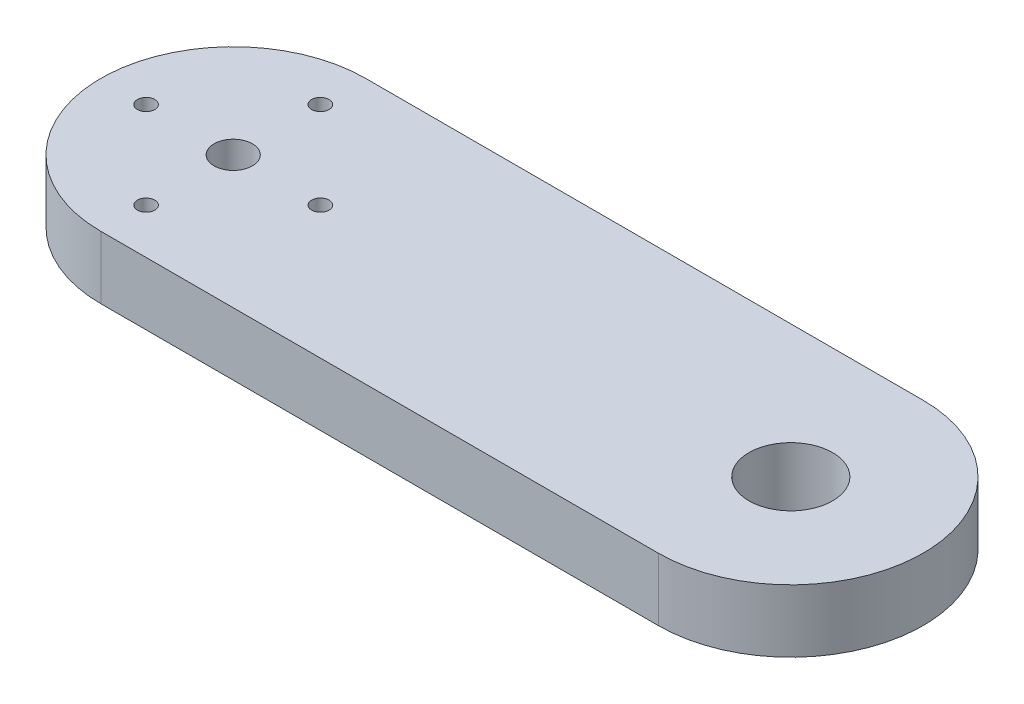
ISO-10303-21;
HEADER;
FILE_DESCRIPTION(('STEP AP214'),'2;1');
FILE_NAME('part.step','',(''),(''),'','','');
FILE_SCHEMA(('AUTOMOTIVE_DESIGN { 1 0 10303 214 1 1 1 1 }'));
ENDSEC;
DATA;
#1=APPLICATION_CONTEXT('core data for automotive mechanical design processes');
#2=APPLICATION_PROTOCOL_DEFINITION('international standard','automotive_design',2000,#1);
#3=PRODUCT_CONTEXT('',#1,'mechanical');
#4=PRODUCT('Part','Part','',(#3));
#5=PRODUCT_RELATED_PRODUCT_CATEGORY('part','',(#4));
#6=PRODUCT_DEFINITION_FORMATION('','',#4);
#7=PRODUCT_DEFINITION_CONTEXT('part definition',#1,'design');
#8=PRODUCT_DEFINITION('design','',#6,#7);
#9=PRODUCT_DEFINITION_SHAPE('','',#8);
#10=(LENGTH_UNIT() NAMED_UNIT(*) SI_UNIT(.MILLI.,.METRE.));
#11=(NAMED_UNIT(*) PLANE_ANGLE_UNIT() SI_UNIT($,.RADIAN.));
#12=(NAMED_UNIT(*) SI_UNIT($,.STERADIAN.) SOLID_ANGLE_UNIT());
#13=UNCERTAINTY_MEASURE_WITH_UNIT(LENGTH_MEASURE(1.E-05),#10,'distance_accuracy_value','');
#14=(GEOMETRIC_REPRESENTATION_CONTEXT(3) GLOBAL_UNCERTAINTY_ASSIGNED_CONTEXT((#13)) GLOBAL_UNIT_ASSIGNED_CONTEXT((#10,
#11,#12)) REPRESENTATION_CONTEXT('',''));
#15=CARTESIAN_POINT('',(0.,0.,0.));
#16=DIRECTION('',(0.,0.,1.));
#17=DIRECTION('',(1.,0.,0.));
#18=AXIS2_PLACEMENT_3D('',#15,#16,#17);
#19=CARTESIAN_POINT('',(0.,9.,0.));
#20=DIRECTION('',(0.,1.,0.));
#21=DIRECTION('',(0.,0.,1.));
#22=AXIS2_PLACEMENT_3D('',#19,#20,#21);
#23=PLANE('',#22);
#24=CARTESIAN_POINT('',(0.,9.,-12.5));
#25=DIRECTION('',(0.,1.,0.));
#26=DIRECTION('',(0.,0.,1.));
#27=AXIS2_PLACEMENT_3D('',#24,#25,#26);
#28=CIRCLE('',#27,1.24999999999999);
#29=CARTESIAN_POINT('',(0.,9.,-11.25));
#30=VERTEX_POINT('',#29);
#31=EDGE_CURVE('E145',#30,#30,#28,.T.);
#32=ORIENTED_EDGE('',*,*,#31,.F.);
#33=EDGE_LOOP('',(#32));
#34=FACE_BOUND('',#33,.T.);
#35=CARTESIAN_POINT('',(12.5000000000004,9.,-3.53740559381116E-13));
#36=DIRECTION('',(0.,1.,0.));
#37=DIRECTION('',(0.,0.,1.));
#38=AXIS2_PLACEMENT_3D('',#35,#36,#37);
#39=CIRCLE('',#38,1.24999999999999);
#40=CARTESIAN_POINT('',(12.5000000000004,9.,1.24999999999963));
#41=VERTEX_POINT('',#40);
#42=EDGE_CURVE('E139',#41,#41,#39,.T.);
#43=ORIENTED_EDGE('',*,*,#42,.F.);
#44=EDGE_LOOP('',(#43));
#45=FACE_BOUND('',#44,.T.);
#46=CARTESIAN_POINT('',(7.07481118762232E-13,9.,12.5));
#47=DIRECTION('',(0.,1.,0.));
#48=DIRECTION('',(0.,0.,1.));
#49=AXIS2_PLACEMENT_3D('',#46,#47,#48);
#50=CIRCLE('',#49,1.24999999999999);
#51=CARTESIAN_POINT('',(7.07481118762232E-13,9.,13.75));
#52=VERTEX_POINT('',#51);
#53=EDGE_CURVE('E133',#52,#52,#50,.T.);
#54=ORIENTED_EDGE('',*,*,#53,.F.);
#55=EDGE_LOOP('',(#54));
#56=FACE_BOUND('',#55,.T.);
#57=CARTESIAN_POINT('',(-12.4999999999996,9.,3.5527136788005E-13));
#58=DIRECTION('',(0.,1.,0.));
#59=DIRECTION('',(0.,0.,1.));
#60=AXIS2_PLACEMENT_3D('',#57,#58,#59);
#61=CIRCLE('',#60,1.24999999999999);
#62=CARTESIAN_POINT('',(-12.4999999999996,9.,1.25000000000034));
#63=VERTEX_POINT('',#62);
#64=EDGE_CURVE('E127',#63,#63,#61,.T.);
#65=ORIENTED_EDGE('',*,*,#64,.F.);
#66=EDGE_LOOP('',(#65));
#67=FACE_BOUND('',#66,.T.);
#68=CARTESIAN_POINT('',(0.,9.,0.));
#69=DIRECTION('',(0.,1.,0.));
#70=DIRECTION('',(0.,0.,1.));
#71=AXIS2_PLACEMENT_3D('',#68,#69,#70);
#72=CIRCLE('',#71,2.75);
#73=CARTESIAN_POINT('',(0.,9.,2.75));
#74=VERTEX_POINT('',#73);
#75=EDGE_CURVE('E101',#74,#74,#72,.T.);
#76=ORIENTED_EDGE('',*,*,#75,.F.);
#77=EDGE_LOOP('',(#76));
#78=FACE_BOUND('',#77,.T.);
#79=CARTESIAN_POINT('',(0.,9.,0.));
#80=DIRECTION('',(0.,1.,0.));
#81=DIRECTION('',(0.,0.,1.));
#82=AXIS2_PLACEMENT_3D('',#79,#80,#81);
#83=CIRCLE('',#82,19.);
#84=CARTESIAN_POINT('',(0.,9.,-19.));
#85=VERTEX_POINT('',#84);
#86=CARTESIAN_POINT('',(0.,9.,19.));
#87=VERTEX_POINT('',#86);
#88=EDGE_CURVE('E86',#85,#87,#83,.T.);
#89=ORIENTED_EDGE('',*,*,#88,.T.);
#90=DIRECTION('',(1.,0.,0.));
#91=VECTOR('',#90,1.);
#92=CARTESIAN_POINT('',(0.,9.,19.));
#93=LINE('',#92,#91);
#94=CARTESIAN_POINT('',(80.,9.,19.));
#95=VERTEX_POINT('',#94);
#96=EDGE_CURVE('E81',#87,#95,#93,.T.);
#97=ORIENTED_EDGE('',*,*,#96,.T.);
#98=CARTESIAN_POINT('',(80.,9.,0.));
#99=DIRECTION('',(0.,1.,0.));
#100=DIRECTION('',(0.,0.,1.));
#101=AXIS2_PLACEMENT_3D('',#98,#99,#100);
#102=CIRCLE('',#101,19.);
#103=CARTESIAN_POINT('',(80.,9.,-19.));
#104=VERTEX_POINT('',#103);
#105=EDGE_CURVE('E84',#95,#104,#102,.T.);
#106=ORIENTED_EDGE('',*,*,#105,.T.);
#107=DIRECTION('',(-1.,0.,0.));
#108=VECTOR('',#107,1.);
#109=CARTESIAN_POINT('',(0.,9.,-19.));
#110=LINE('',#109,#108);
#111=EDGE_CURVE('E51',#104,#85,#110,.T.);
#112=ORIENTED_EDGE('',*,*,#111,.T.);
#113=EDGE_LOOP('',(#89,#97,#106,#112));
#114=FACE_BOUND('',#113,.T.);
#115=CARTESIAN_POINT('',(80.,9.,0.));
#116=DIRECTION('',(0.,1.,0.));
#117=DIRECTION('',(0.,0.,1.));
#118=AXIS2_PLACEMENT_3D('',#115,#116,#117);
#119=CIRCLE('',#118,6.);
#120=CARTESIAN_POINT('',(80.,9.,6.));
#121=VERTEX_POINT('',#120);
#122=EDGE_CURVE('E116',#121,#121,#119,.T.);
#123=ORIENTED_EDGE('',*,*,#122,.F.);
#124=EDGE_LOOP('',(#123));
#125=FACE_BOUND('',#124,.T.);
#126=ADVANCED_FACE('F34',(#34,#45,#56,#67,#78,#114,#125),#23,.T.);
#127=CARTESIAN_POINT('',(0.,0.,0.));
#128=DIRECTION('',(0.,1.,0.));
#129=DIRECTION('',(0.,0.,1.));
#130=AXIS2_PLACEMENT_3D('',#127,#128,#129);
#131=PLANE('',#130);
#132=CARTESIAN_POINT('',(0.,0.,-12.5));
#133=DIRECTION('',(0.,1.,0.));
#134=DIRECTION('',(0.,0.,1.));
#135=AXIS2_PLACEMENT_3D('',#132,#133,#134);
#136=CIRCLE('',#135,1.25);
#137=CARTESIAN_POINT('',(0.,0.,-11.25));
#138=VERTEX_POINT('',#137);
#139=EDGE_CURVE('E142',#138,#138,#136,.T.);
#140=ORIENTED_EDGE('',*,*,#139,.T.);
#141=EDGE_LOOP('',(#140));
#142=FACE_BOUND('',#141,.T.);
#143=CARTESIAN_POINT('',(12.5000000000004,0.,-3.53740559381116E-13));
#144=DIRECTION('',(0.,1.,0.));
#145=DIRECTION('',(0.,0.,1.));
#146=AXIS2_PLACEMENT_3D('',#143,#144,#145);
#147=CIRCLE('',#146,1.25);
#148=CARTESIAN_POINT('',(12.5000000000004,0.,1.24999999999964));
#149=VERTEX_POINT('',#148);
#150=EDGE_CURVE('E136',#149,#149,#147,.T.);
#151=ORIENTED_EDGE('',*,*,#150,.T.);
#152=EDGE_LOOP('',(#151));
#153=FACE_BOUND('',#152,.T.);
#154=CARTESIAN_POINT('',(7.07481118762232E-13,0.,12.5));
#155=DIRECTION('',(0.,1.,0.));
#156=DIRECTION('',(0.,0.,1.));
#157=AXIS2_PLACEMENT_3D('',#154,#155,#156);
#158=CIRCLE('',#157,1.25);
#159=CARTESIAN_POINT('',(7.07481118762232E-13,0.,13.75));
#160=VERTEX_POINT('',#159);
#161=EDGE_CURVE('E130',#160,#160,#158,.T.);
#162=ORIENTED_EDGE('',*,*,#161,.T.);
#163=EDGE_LOOP('',(#162));
#164=FACE_BOUND('',#163,.T.);
#165=CARTESIAN_POINT('',(-12.4999999999996,0.,3.5527136788005E-13));
#166=DIRECTION('',(0.,1.,0.));
#167=DIRECTION('',(0.,0.,1.));
#168=AXIS2_PLACEMENT_3D('',#165,#166,#167);
#169=CIRCLE('',#168,1.25);
#170=CARTESIAN_POINT('',(-12.4999999999996,0.,1.25000000000035));
#171=VERTEX_POINT('',#170);
#172=EDGE_CURVE('E122',#171,#171,#169,.T.);
#173=ORIENTED_EDGE('',*,*,#172,.T.);
#174=EDGE_LOOP('',(#173));
#175=FACE_BOUND('',#174,.T.);
#176=CARTESIAN_POINT('',(0.,0.,0.));
#177=DIRECTION('',(0.,1.,0.));
#178=DIRECTION('',(0.,0.,1.));
#179=AXIS2_PLACEMENT_3D('',#176,#177,#178);
#180=CIRCLE('',#179,2.75);
#181=CARTESIAN_POINT('',(0.,0.,2.75));
#182=VERTEX_POINT('',#181);
#183=EDGE_CURVE('E113',#182,#182,#180,.T.);
#184=ORIENTED_EDGE('',*,*,#183,.T.);
#185=EDGE_LOOP('',(#184));
#186=FACE_BOUND('',#185,.T.);
#187=CARTESIAN_POINT('',(0.,0.,0.));
#188=DIRECTION('',(0.,1.,0.));
#189=DIRECTION('',(0.,0.,1.));
#190=AXIS2_PLACEMENT_3D('',#187,#188,#189);
#191=CIRCLE('',#190,19.);
#192=CARTESIAN_POINT('',(0.,0.,-19.));
#193=VERTEX_POINT('',#192);
#194=CARTESIAN_POINT('',(0.,0.,19.));
#195=VERTEX_POINT('',#194);
#196=EDGE_CURVE('E98',#193,#195,#191,.T.);
#197=ORIENTED_EDGE('',*,*,#196,.F.);
#198=DIRECTION('',(-1.,0.,0.));
#199=VECTOR('',#198,1.);
#200=CARTESIAN_POINT('',(0.,0.,-19.));
#201=LINE('',#200,#199);
#202=CARTESIAN_POINT('',(80.,0.,-19.));
#203=VERTEX_POINT('',#202);
#204=EDGE_CURVE('E74',#203,#193,#201,.T.);
#205=ORIENTED_EDGE('',*,*,#204,.F.);
#206=CARTESIAN_POINT('',(80.,0.,0.));
#207=DIRECTION('',(0.,1.,0.));
#208=DIRECTION('',(0.,0.,1.));
#209=AXIS2_PLACEMENT_3D('',#206,#207,#208);
#210=CIRCLE('',#209,19.);
#211=CARTESIAN_POINT('',(80.,0.,19.));
#212=VERTEX_POINT('',#211);
#213=EDGE_CURVE('E68',#212,#203,#210,.T.);
#214=ORIENTED_EDGE('',*,*,#213,.F.);
#215=DIRECTION('',(1.,0.,0.));
#216=VECTOR('',#215,1.);
#217=CARTESIAN_POINT('',(0.,0.,19.));
#218=LINE('',#217,#216);
#219=EDGE_CURVE('E90',#195,#212,#218,.T.);
#220=ORIENTED_EDGE('',*,*,#219,.F.);
#221=EDGE_LOOP('',(#197,#205,#214,#220));
#222=FACE_BOUND('',#221,.T.);
#223=CARTESIAN_POINT('',(80.,0.,0.));
#224=DIRECTION('',(0.,1.,0.));
#225=DIRECTION('',(0.,0.,1.));
#226=AXIS2_PLACEMENT_3D('',#223,#224,#225);
#227=CIRCLE('',#226,6.);
#228=CARTESIAN_POINT('',(80.,0.,6.));
#229=VERTEX_POINT('',#228);
#230=EDGE_CURVE('E119',#229,#229,#227,.T.);
#231=ORIENTED_EDGE('',*,*,#230,.T.);
#232=EDGE_LOOP('',(#231));
#233=FACE_BOUND('',#232,.T.);
#234=ADVANCED_FACE('F109',(#142,#153,#164,#175,#186,#222,#233),#131,.F.);
#235=CARTESIAN_POINT('',(0.,9.,0.));
#236=DIRECTION('',(0.,-1.,0.));
#237=DIRECTION('',(0.,0.,-1.));
#238=AXIS2_PLACEMENT_3D('',#235,#236,#237);
#239=CYLINDRICAL_SURFACE('',#238,19.);
#240=ORIENTED_EDGE('',*,*,#196,.T.);
#241=DIRECTION('',(0.,-1.,0.));
#242=VECTOR('',#241,1.);
#243=CARTESIAN_POINT('',(0.,9.,19.));
#244=LINE('',#243,#242);
#245=EDGE_CURVE('E11',#87,#195,#244,.T.);
#246=ORIENTED_EDGE('',*,*,#245,.F.);
#247=ORIENTED_EDGE('',*,*,#88,.F.);
#248=DIRECTION('',(0.,-1.,0.));
#249=VECTOR('',#248,1.);
#250=CARTESIAN_POINT('',(0.,9.,-19.));
#251=LINE('',#250,#249);
#252=EDGE_CURVE('E94',#85,#193,#251,.T.);
#253=ORIENTED_EDGE('',*,*,#252,.T.);
#254=EDGE_LOOP('',(#240,#246,#247,#253));
#255=FACE_BOUND('',#254,.T.);
#256=ADVANCED_FACE('F36',(#255),#239,.T.);
#257=CARTESIAN_POINT('',(0.,9.,19.));
#258=DIRECTION('',(0.,0.,-1.));
#259=DIRECTION('',(-1.,0.,0.));
#260=AXIS2_PLACEMENT_3D('',#257,#258,#259);
#261=PLANE('',#260);
#262=ORIENTED_EDGE('',*,*,#219,.T.);
#263=DIRECTION('',(0.,-1.,0.));
#264=VECTOR('',#263,1.);
#265=CARTESIAN_POINT('',(80.,9.,19.));
#266=LINE('',#265,#264);
#267=EDGE_CURVE('E43',#95,#212,#266,.T.);
#268=ORIENTED_EDGE('',*,*,#267,.F.);
#269=ORIENTED_EDGE('',*,*,#96,.F.);
#270=ORIENTED_EDGE('',*,*,#245,.T.);
#271=EDGE_LOOP('',(#262,#268,#269,#270));
#272=FACE_BOUND('',#271,.T.);
#273=ADVANCED_FACE('F89',(#272),#261,.F.);
#274=CARTESIAN_POINT('',(80.,9.,0.));
#275=DIRECTION('',(0.,-1.,0.));
#276=DIRECTION('',(0.,0.,-1.));
#277=AXIS2_PLACEMENT_3D('',#274,#275,#276);
#278=CYLINDRICAL_SURFACE('',#277,19.);
#279=ORIENTED_EDGE('',*,*,#213,.T.);
#280=DIRECTION('',(0.,-1.,0.));
#281=VECTOR('',#280,1.);
#282=CARTESIAN_POINT('',(80.,9.,-19.));
#283=LINE('',#282,#281);
#284=EDGE_CURVE('E91',#104,#203,#283,.T.);
#285=ORIENTED_EDGE('',*,*,#284,.F.);
#286=ORIENTED_EDGE('',*,*,#105,.F.);
#287=ORIENTED_EDGE('',*,*,#267,.T.);
#288=EDGE_LOOP('',(#279,#285,#286,#287));
#289=FACE_BOUND('',#288,.T.);
#290=ADVANCED_FACE('F92',(#289),#278,.T.);
#291=CARTESIAN_POINT('',(0.,9.,-19.));
#292=DIRECTION('',(0.,0.,1.));
#293=DIRECTION('',(1.,0.,0.));
#294=AXIS2_PLACEMENT_3D('',#291,#292,#293);
#295=PLANE('',#294);
#296=ORIENTED_EDGE('',*,*,#204,.T.);
#297=ORIENTED_EDGE('',*,*,#252,.F.);
#298=ORIENTED_EDGE('',*,*,#111,.F.);
#299=ORIENTED_EDGE('',*,*,#284,.T.);
#300=EDGE_LOOP('',(#296,#297,#298,#299));
#301=FACE_BOUND('',#300,.T.);
#302=ADVANCED_FACE('F106',(#301),#295,.F.);
#303=CARTESIAN_POINT('',(0.,9.,0.));
#304=DIRECTION('',(0.,-1.,0.));
#305=DIRECTION('',(0.,0.,-1.));
#306=AXIS2_PLACEMENT_3D('',#303,#304,#305);
#307=CYLINDRICAL_SURFACE('',#306,2.75);
#308=ORIENTED_EDGE('',*,*,#75,.T.);
#309=EDGE_LOOP('',(#308));
#310=FACE_BOUND('',#309,.T.);
#311=ORIENTED_EDGE('',*,*,#183,.F.);
#312=EDGE_LOOP('',(#311));
#313=FACE_BOUND('',#312,.T.);
#314=ADVANCED_FACE('F162',(#310,#313),#307,.F.);
#315=CARTESIAN_POINT('',(80.,9.,0.));
#316=DIRECTION('',(0.,-1.,0.));
#317=DIRECTION('',(0.,0.,-1.));
#318=AXIS2_PLACEMENT_3D('',#315,#316,#317);
#319=CYLINDRICAL_SURFACE('',#318,6.);
#320=ORIENTED_EDGE('',*,*,#122,.T.);
#321=EDGE_LOOP('',(#320));
#322=FACE_BOUND('',#321,.T.);
#323=ORIENTED_EDGE('',*,*,#230,.F.);
#324=EDGE_LOOP('',(#323));
#325=FACE_BOUND('',#324,.T.);
#326=ADVANCED_FACE('F165',(#322,#325),#319,.F.);
#327=CARTESIAN_POINT('',(-12.4999999999996,9.,3.5527136788005E-13));
#328=DIRECTION('',(0.,1.,0.));
#329=DIRECTION('',(0.,0.,1.));
#330=AXIS2_PLACEMENT_3D('',#327,#328,#329);
#331=CYLINDRICAL_SURFACE('',#330,1.24999999999999);
#332=ORIENTED_EDGE('',*,*,#172,.F.);
#333=EDGE_LOOP('',(#332));
#334=FACE_BOUND('',#333,.T.);
#335=ORIENTED_EDGE('',*,*,#64,.T.);
#336=EDGE_LOOP('',(#335));
#337=FACE_BOUND('',#336,.T.);
#338=ADVANCED_FACE('F203',(#334,#337),#331,.F.);
#339=CARTESIAN_POINT('',(7.07481118762232E-13,9.,12.5));
#340=DIRECTION('',(0.,1.,0.));
#341=DIRECTION('',(0.,0.,1.));
#342=AXIS2_PLACEMENT_3D('',#339,#340,#341);
#343=CYLINDRICAL_SURFACE('',#342,1.24999999999999);
#344=ORIENTED_EDGE('',*,*,#161,.F.);
#345=EDGE_LOOP('',(#344));
#346=FACE_BOUND('',#345,.T.);
#347=ORIENTED_EDGE('',*,*,#53,.T.);
#348=EDGE_LOOP('',(#347));
#349=FACE_BOUND('',#348,.T.);
#350=ADVANCED_FACE('F212',(#346,#349),#343,.F.);
#351=CARTESIAN_POINT('',(12.5000000000004,9.,-3.53740559381116E-13));
#352=DIRECTION('',(0.,1.,0.));
#353=DIRECTION('',(0.,0.,1.));
#354=AXIS2_PLACEMENT_3D('',#351,#352,#353);
#355=CYLINDRICAL_SURFACE('',#354,1.24999999999999);
#356=ORIENTED_EDGE('',*,*,#150,.F.);
#357=EDGE_LOOP('',(#356));
#358=FACE_BOUND('',#357,.T.);
#359=ORIENTED_EDGE('',*,*,#42,.T.);
#360=EDGE_LOOP('',(#359));
#361=FACE_BOUND('',#360,.T.);
#362=ADVANCED_FACE('F220',(#358,#361),#355,.F.);
#363=CARTESIAN_POINT('',(0.,9.,-12.5));
#364=DIRECTION('',(0.,1.,0.));
#365=DIRECTION('',(0.,0.,1.));
#366=AXIS2_PLACEMENT_3D('',#363,#364,#365);
#367=CYLINDRICAL_SURFACE('',#366,1.24999999999999);
#368=ORIENTED_EDGE('',*,*,#139,.F.);
#369=EDGE_LOOP('',(#368));
#370=FACE_BOUND('',#369,.T.);
#371=ORIENTED_EDGE('',*,*,#31,.T.);
#372=EDGE_LOOP('',(#371));
#373=FACE_BOUND('',#372,.T.);
#374=ADVANCED_FACE('F149',(#370,#373),#367,.F.);
#375=CLOSED_SHELL('',(#126,#234,#256,#273,#290,#302,#314,#326,#338,#350,#362,#374));
#376=MANIFOLD_SOLID_BREP('B2',#375);
#377=ADVANCED_BREP_SHAPE_REPRESENTATION('',(#18,#376),#14);
#378=SHAPE_DEFINITION_REPRESENTATION(#9,#377);
ENDSEC;
END-ISO-10303-21;
